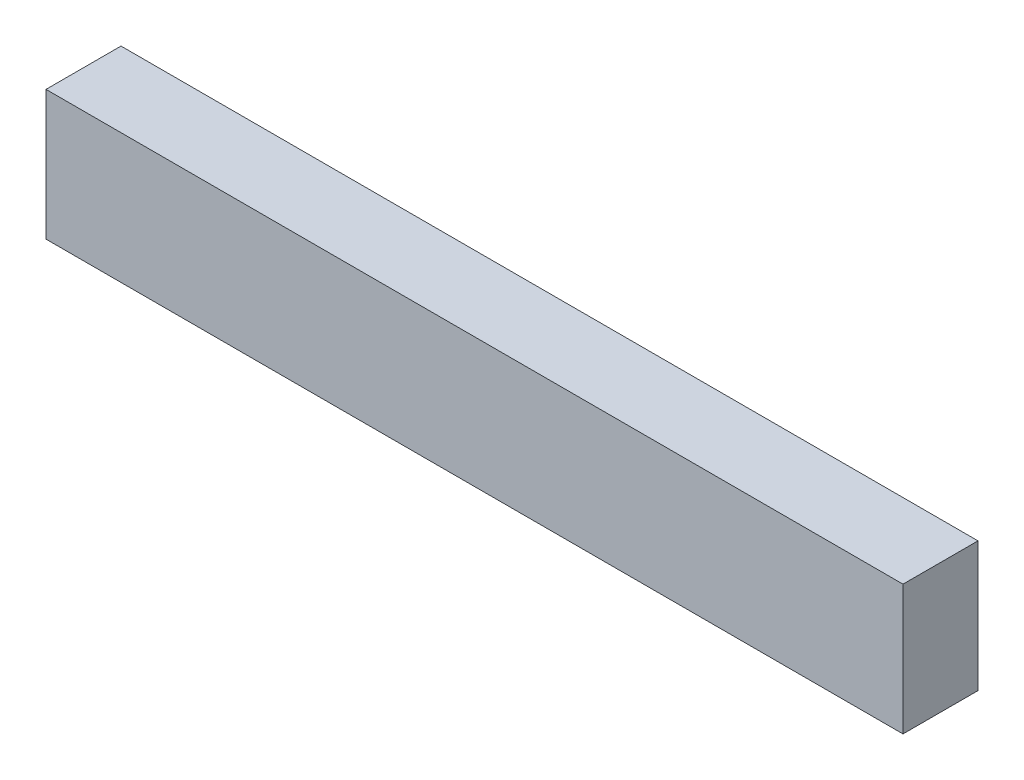
ISO-10303-21;
HEADER;
FILE_DESCRIPTION(('STEP AP214'),'2;1');
FILE_NAME('part.step','',(''),(''),'','','');
FILE_SCHEMA(('AUTOMOTIVE_DESIGN { 1 0 10303 214 1 1 1 1 }'));
ENDSEC;
DATA;
#1=APPLICATION_CONTEXT('core data for automotive mechanical design processes');
#2=APPLICATION_PROTOCOL_DEFINITION('international standard','automotive_design',2000,#1);
#3=PRODUCT_CONTEXT('',#1,'mechanical');
#4=PRODUCT('Part','Part','',(#3));
#5=PRODUCT_RELATED_PRODUCT_CATEGORY('part','',(#4));
#6=PRODUCT_DEFINITION_FORMATION('','',#4);
#7=PRODUCT_DEFINITION_CONTEXT('part definition',#1,'design');
#8=PRODUCT_DEFINITION('design','',#6,#7);
#9=PRODUCT_DEFINITION_SHAPE('','',#8);
#10=(LENGTH_UNIT() NAMED_UNIT(*) SI_UNIT(.MILLI.,.METRE.));
#11=(NAMED_UNIT(*) PLANE_ANGLE_UNIT() SI_UNIT($,.RADIAN.));
#12=(NAMED_UNIT(*) SI_UNIT($,.STERADIAN.) SOLID_ANGLE_UNIT());
#13=UNCERTAINTY_MEASURE_WITH_UNIT(LENGTH_MEASURE(1.E-05),#10,'distance_accuracy_value','');
#14=(GEOMETRIC_REPRESENTATION_CONTEXT(3) GLOBAL_UNCERTAINTY_ASSIGNED_CONTEXT((#13)) GLOBAL_UNIT_ASSIGNED_CONTEXT((#10,
#11,#12)) REPRESENTATION_CONTEXT('',''));
#15=CARTESIAN_POINT('',(0.,0.,0.));
#16=DIRECTION('',(0.,0.,1.));
#17=DIRECTION('',(1.,0.,0.));
#18=AXIS2_PLACEMENT_3D('',#15,#16,#17);
#19=CARTESIAN_POINT('',(-16.7754999999996,46.13,7.25));
#20=DIRECTION('',(1.,0.,0.));
#21=DIRECTION('',(0.,0.,-1.));
#22=AXIS2_PLACEMENT_3D('',#19,#20,#21);
#23=PLANE('',#22);
#24=DIRECTION('',(0.,-1.,0.));
#25=VECTOR('',#24,1.);
#26=CARTESIAN_POINT('',(-16.7754999999996,46.13,0.));
#27=LINE('',#26,#25);
#28=CARTESIAN_POINT('',(-16.7754999999996,46.13,0.));
#29=VERTEX_POINT('',#28);
#30=CARTESIAN_POINT('',(-16.7754999999996,33.59,0.));
#31=VERTEX_POINT('',#30);
#32=EDGE_CURVE('E128',#29,#31,#27,.T.);
#33=ORIENTED_EDGE('',*,*,#32,.T.);
#34=DIRECTION('',(0.,0.,-1.));
#35=VECTOR('',#34,1.);
#36=CARTESIAN_POINT('',(-16.7754999999996,33.59,7.25));
#37=LINE('',#36,#35);
#38=CARTESIAN_POINT('',(-16.7754999999996,33.59,7.25));
#39=VERTEX_POINT('',#38);
#40=EDGE_CURVE('E11',#39,#31,#37,.T.);
#41=ORIENTED_EDGE('',*,*,#40,.F.);
#42=DIRECTION('',(0.,-1.,0.));
#43=VECTOR('',#42,1.);
#44=CARTESIAN_POINT('',(-16.7754999999996,46.13,7.25));
#45=LINE('',#44,#43);
#46=CARTESIAN_POINT('',(-16.7754999999996,46.13,7.25));
#47=VERTEX_POINT('',#46);
#48=EDGE_CURVE('E148',#47,#39,#45,.T.);
#49=ORIENTED_EDGE('',*,*,#48,.F.);
#50=DIRECTION('',(0.,0.,-1.));
#51=VECTOR('',#50,1.);
#52=CARTESIAN_POINT('',(-16.7754999999996,46.13,7.25));
#53=LINE('',#52,#51);
#54=EDGE_CURVE('E153',#47,#29,#53,.T.);
#55=ORIENTED_EDGE('',*,*,#54,.T.);
#56=EDGE_LOOP('',(#33,#41,#49,#55));
#57=FACE_BOUND('',#56,.T.);
#58=ADVANCED_FACE('F32',(#57),#23,.F.);
#59=CARTESIAN_POINT('',(-16.7754999999996,33.59,7.25));
#60=DIRECTION('',(0.,1.,0.));
#61=DIRECTION('',(0.,0.,1.));
#62=AXIS2_PLACEMENT_3D('',#59,#60,#61);
#63=PLANE('',#62);
#64=DIRECTION('',(1.,0.,0.));
#65=VECTOR('',#64,1.);
#66=CARTESIAN_POINT('',(-16.7754999999996,33.59,0.));
#67=LINE('',#66,#65);
#68=CARTESIAN_POINT('',(66.0645000000004,33.59,0.));
#69=VERTEX_POINT('',#68);
#70=EDGE_CURVE('E132',#31,#69,#67,.T.);
#71=ORIENTED_EDGE('',*,*,#70,.T.);
#72=DIRECTION('',(0.,0.,-1.));
#73=VECTOR('',#72,1.);
#74=CARTESIAN_POINT('',(66.0645000000004,33.59,7.25));
#75=LINE('',#74,#73);
#76=CARTESIAN_POINT('',(66.0645000000004,33.59,7.25));
#77=VERTEX_POINT('',#76);
#78=EDGE_CURVE('E39',#77,#69,#75,.T.);
#79=ORIENTED_EDGE('',*,*,#78,.F.);
#80=DIRECTION('',(1.,0.,0.));
#81=VECTOR('',#80,1.);
#82=CARTESIAN_POINT('',(-16.7754999999996,33.59,7.25));
#83=LINE('',#82,#81);
#84=EDGE_CURVE('E83',#39,#77,#83,.T.);
#85=ORIENTED_EDGE('',*,*,#84,.F.);
#86=ORIENTED_EDGE('',*,*,#40,.T.);
#87=EDGE_LOOP('',(#71,#79,#85,#86));
#88=FACE_BOUND('',#87,.T.);
#89=ADVANCED_FACE('F182',(#88),#63,.F.);
#90=CARTESIAN_POINT('',(66.0645000000004,46.13,7.25));
#91=DIRECTION('',(-1.,0.,0.));
#92=DIRECTION('',(0.,0.,1.));
#93=AXIS2_PLACEMENT_3D('',#90,#91,#92);
#94=PLANE('',#93);
#95=DIRECTION('',(0.,1.,0.));
#96=VECTOR('',#95,1.);
#97=CARTESIAN_POINT('',(66.0645000000004,46.13,0.));
#98=LINE('',#97,#96);
#99=CARTESIAN_POINT('',(66.0645000000004,46.13,0.));
#100=VERTEX_POINT('',#99);
#101=EDGE_CURVE('E156',#69,#100,#98,.T.);
#102=ORIENTED_EDGE('',*,*,#101,.T.);
#103=DIRECTION('',(0.,0.,-1.));
#104=VECTOR('',#103,1.);
#105=CARTESIAN_POINT('',(66.0645000000004,46.13,7.25));
#106=LINE('',#105,#104);
#107=CARTESIAN_POINT('',(66.0645000000004,46.13,7.25));
#108=VERTEX_POINT('',#107);
#109=EDGE_CURVE('E160',#108,#100,#106,.T.);
#110=ORIENTED_EDGE('',*,*,#109,.F.);
#111=DIRECTION('',(0.,1.,0.));
#112=VECTOR('',#111,1.);
#113=CARTESIAN_POINT('',(66.0645000000004,46.13,7.25));
#114=LINE('',#113,#112);
#115=EDGE_CURVE('E151',#77,#108,#114,.T.);
#116=ORIENTED_EDGE('',*,*,#115,.F.);
#117=ORIENTED_EDGE('',*,*,#78,.T.);
#118=EDGE_LOOP('',(#102,#110,#116,#117));
#119=FACE_BOUND('',#118,.T.);
#120=ADVANCED_FACE('F165',(#119),#94,.F.);
#121=CARTESIAN_POINT('',(-16.7754999999996,46.13,7.25));
#122=DIRECTION('',(0.,-1.,0.));
#123=DIRECTION('',(0.,0.,-1.));
#124=AXIS2_PLACEMENT_3D('',#121,#122,#123);
#125=PLANE('',#124);
#126=DIRECTION('',(-1.,0.,0.));
#127=VECTOR('',#126,1.);
#128=CARTESIAN_POINT('',(-16.7754999999996,46.13,0.));
#129=LINE('',#128,#127);
#130=EDGE_CURVE('E76',#100,#29,#129,.T.);
#131=ORIENTED_EDGE('',*,*,#130,.T.);
#132=ORIENTED_EDGE('',*,*,#54,.F.);
#133=DIRECTION('',(-1.,0.,0.));
#134=VECTOR('',#133,1.);
#135=CARTESIAN_POINT('',(-16.7754999999996,46.13,7.25));
#136=LINE('',#135,#134);
#137=EDGE_CURVE('E55',#108,#47,#136,.T.);
#138=ORIENTED_EDGE('',*,*,#137,.F.);
#139=ORIENTED_EDGE('',*,*,#109,.T.);
#140=EDGE_LOOP('',(#131,#132,#138,#139));
#141=FACE_BOUND('',#140,.T.);
#142=ADVANCED_FACE('F173',(#141),#125,.F.);
#143=CARTESIAN_POINT('',(0.,0.,7.25));
#144=DIRECTION('',(0.,0.,1.));
#145=DIRECTION('',(1.,0.,0.));
#146=AXIS2_PLACEMENT_3D('',#143,#144,#145);
#147=PLANE('',#146);
#148=ORIENTED_EDGE('',*,*,#48,.T.);
#149=ORIENTED_EDGE('',*,*,#84,.T.);
#150=ORIENTED_EDGE('',*,*,#115,.T.);
#151=ORIENTED_EDGE('',*,*,#137,.T.);
#152=EDGE_LOOP('',(#148,#149,#150,#151));
#153=FACE_BOUND('',#152,.T.);
#154=ADVANCED_FACE('F175',(#153),#147,.T.);
#155=CARTESIAN_POINT('',(0.,0.,0.));
#156=DIRECTION('',(0.,0.,1.));
#157=DIRECTION('',(1.,0.,0.));
#158=AXIS2_PLACEMENT_3D('',#155,#156,#157);
#159=PLANE('',#158);
#160=DIRECTION('',(-1.,0.,0.));
#161=VECTOR('',#160,1.);
#162=CARTESIAN_POINT('',(-16.7754999999996,45.63,0.));
#163=LINE('',#162,#161);
#164=CARTESIAN_POINT('',(65.5645000000004,45.63,0.));
#165=VERTEX_POINT('',#164);
#166=CARTESIAN_POINT('',(-16.2754999999996,45.63,0.));
#167=VERTEX_POINT('',#166);
#168=EDGE_CURVE('E123',#165,#167,#163,.T.);
#169=ORIENTED_EDGE('',*,*,#168,.T.);
#170=DIRECTION('',(0.,-1.,0.));
#171=VECTOR('',#170,1.);
#172=CARTESIAN_POINT('',(-16.2754999999996,46.13,0.));
#173=LINE('',#172,#171);
#174=CARTESIAN_POINT('',(-16.2754999999996,34.09,0.));
#175=VERTEX_POINT('',#174);
#176=EDGE_CURVE('E142',#167,#175,#173,.T.);
#177=ORIENTED_EDGE('',*,*,#176,.T.);
#178=DIRECTION('',(1.,0.,0.));
#179=VECTOR('',#178,1.);
#180=CARTESIAN_POINT('',(-16.7754999999996,34.09,0.));
#181=LINE('',#180,#179);
#182=CARTESIAN_POINT('',(65.5645000000004,34.09,0.));
#183=VERTEX_POINT('',#182);
#184=EDGE_CURVE('E127',#175,#183,#181,.T.);
#185=ORIENTED_EDGE('',*,*,#184,.T.);
#186=DIRECTION('',(0.,1.,0.));
#187=VECTOR('',#186,1.);
#188=CARTESIAN_POINT('',(65.5645000000004,46.13,0.));
#189=LINE('',#188,#187);
#190=EDGE_CURVE('E46',#183,#165,#189,.T.);
#191=ORIENTED_EDGE('',*,*,#190,.T.);
#192=EDGE_LOOP('',(#169,#177,#185,#191));
#193=FACE_BOUND('',#192,.T.);
#194=ORIENTED_EDGE('',*,*,#32,.F.);
#195=ORIENTED_EDGE('',*,*,#130,.F.);
#196=ORIENTED_EDGE('',*,*,#101,.F.);
#197=ORIENTED_EDGE('',*,*,#70,.F.);
#198=EDGE_LOOP('',(#194,#195,#196,#197));
#199=FACE_BOUND('',#198,.T.);
#200=ADVANCED_FACE('F169',(#193,#199),#159,.F.);
#201=CARTESIAN_POINT('',(-16.2754999999996,46.13,7.25));
#202=DIRECTION('',(1.,0.,0.));
#203=DIRECTION('',(0.,0.,-1.));
#204=AXIS2_PLACEMENT_3D('',#201,#202,#203);
#205=PLANE('',#204);
#206=ORIENTED_EDGE('',*,*,#176,.F.);
#207=DIRECTION('',(0.,0.,-1.));
#208=VECTOR('',#207,1.);
#209=CARTESIAN_POINT('',(-16.2754999999996,45.63,7.25));
#210=LINE('',#209,#208);
#211=CARTESIAN_POINT('',(-16.2754999999996,45.63,7.05));
#212=VERTEX_POINT('',#211);
#213=EDGE_CURVE('E122',#212,#167,#210,.T.);
#214=ORIENTED_EDGE('',*,*,#213,.F.);
#215=DIRECTION('',(0.,-1.,0.));
#216=VECTOR('',#215,1.);
#217=CARTESIAN_POINT('',(-16.2754999999996,46.13,7.05));
#218=LINE('',#217,#216);
#219=CARTESIAN_POINT('',(-16.2754999999996,34.09,7.05));
#220=VERTEX_POINT('',#219);
#221=EDGE_CURVE('E110',#212,#220,#218,.T.);
#222=ORIENTED_EDGE('',*,*,#221,.T.);
#223=DIRECTION('',(0.,0.,-1.));
#224=VECTOR('',#223,1.);
#225=CARTESIAN_POINT('',(-16.2754999999996,34.09,7.25));
#226=LINE('',#225,#224);
#227=EDGE_CURVE('E120',#220,#175,#226,.T.);
#228=ORIENTED_EDGE('',*,*,#227,.T.);
#229=EDGE_LOOP('',(#206,#214,#222,#228));
#230=FACE_BOUND('',#229,.T.);
#231=ADVANCED_FACE('F119',(#230),#205,.T.);
#232=CARTESIAN_POINT('',(-16.7754999999996,34.09,7.25));
#233=DIRECTION('',(0.,1.,0.));
#234=DIRECTION('',(0.,0.,1.));
#235=AXIS2_PLACEMENT_3D('',#232,#233,#234);
#236=PLANE('',#235);
#237=ORIENTED_EDGE('',*,*,#184,.F.);
#238=ORIENTED_EDGE('',*,*,#227,.F.);
#239=DIRECTION('',(1.,0.,0.));
#240=VECTOR('',#239,1.);
#241=CARTESIAN_POINT('',(-16.7754999999996,34.09,7.05));
#242=LINE('',#241,#240);
#243=CARTESIAN_POINT('',(65.5645000000004,34.09,7.05));
#244=VERTEX_POINT('',#243);
#245=EDGE_CURVE('E106',#220,#244,#242,.T.);
#246=ORIENTED_EDGE('',*,*,#245,.T.);
#247=DIRECTION('',(0.,0.,-1.));
#248=VECTOR('',#247,1.);
#249=CARTESIAN_POINT('',(65.5645000000004,34.09,7.25));
#250=LINE('',#249,#248);
#251=EDGE_CURVE('E129',#244,#183,#250,.T.);
#252=ORIENTED_EDGE('',*,*,#251,.T.);
#253=EDGE_LOOP('',(#237,#238,#246,#252));
#254=FACE_BOUND('',#253,.T.);
#255=ADVANCED_FACE('F125',(#254),#236,.T.);
#256=CARTESIAN_POINT('',(65.5645000000004,46.13,7.25));
#257=DIRECTION('',(-1.,0.,0.));
#258=DIRECTION('',(0.,0.,1.));
#259=AXIS2_PLACEMENT_3D('',#256,#257,#258);
#260=PLANE('',#259);
#261=ORIENTED_EDGE('',*,*,#190,.F.);
#262=ORIENTED_EDGE('',*,*,#251,.F.);
#263=DIRECTION('',(0.,1.,0.));
#264=VECTOR('',#263,1.);
#265=CARTESIAN_POINT('',(65.5645000000004,46.13,7.05));
#266=LINE('',#265,#264);
#267=CARTESIAN_POINT('',(65.5645000000004,45.63,7.05));
#268=VERTEX_POINT('',#267);
#269=EDGE_CURVE('E111',#244,#268,#266,.T.);
#270=ORIENTED_EDGE('',*,*,#269,.T.);
#271=DIRECTION('',(0.,0.,-1.));
#272=VECTOR('',#271,1.);
#273=CARTESIAN_POINT('',(65.5645000000004,45.63,7.25));
#274=LINE('',#273,#272);
#275=EDGE_CURVE('E134',#268,#165,#274,.T.);
#276=ORIENTED_EDGE('',*,*,#275,.T.);
#277=EDGE_LOOP('',(#261,#262,#270,#276));
#278=FACE_BOUND('',#277,.T.);
#279=ADVANCED_FACE('F230',(#278),#260,.T.);
#280=CARTESIAN_POINT('',(-16.7754999999996,45.63,7.25));
#281=DIRECTION('',(0.,-1.,0.));
#282=DIRECTION('',(0.,0.,-1.));
#283=AXIS2_PLACEMENT_3D('',#280,#281,#282);
#284=PLANE('',#283);
#285=ORIENTED_EDGE('',*,*,#168,.F.);
#286=ORIENTED_EDGE('',*,*,#275,.F.);
#287=DIRECTION('',(-1.,0.,0.));
#288=VECTOR('',#287,1.);
#289=CARTESIAN_POINT('',(-16.7754999999996,45.63,7.05));
#290=LINE('',#289,#288);
#291=EDGE_CURVE('E137',#268,#212,#290,.T.);
#292=ORIENTED_EDGE('',*,*,#291,.T.);
#293=ORIENTED_EDGE('',*,*,#213,.T.);
#294=EDGE_LOOP('',(#285,#286,#292,#293));
#295=FACE_BOUND('',#294,.T.);
#296=ADVANCED_FACE('F239',(#295),#284,.T.);
#297=CARTESIAN_POINT('',(0.,0.,7.05));
#298=DIRECTION('',(0.,0.,1.));
#299=DIRECTION('',(1.,0.,0.));
#300=AXIS2_PLACEMENT_3D('',#297,#298,#299);
#301=PLANE('',#300);
#302=ORIENTED_EDGE('',*,*,#221,.F.);
#303=ORIENTED_EDGE('',*,*,#291,.F.);
#304=ORIENTED_EDGE('',*,*,#269,.F.);
#305=ORIENTED_EDGE('',*,*,#245,.F.);
#306=EDGE_LOOP('',(#302,#303,#304,#305));
#307=FACE_BOUND('',#306,.T.);
#308=ADVANCED_FACE('F108',(#307),#301,.F.);
#309=CLOSED_SHELL('',(#58,#89,#120,#142,#154,#200,#231,#255,#279,#296,#308));
#310=MANIFOLD_SOLID_BREP('B2',#309);
#311=ADVANCED_BREP_SHAPE_REPRESENTATION('',(#18,#310),#14);
#312=SHAPE_DEFINITION_REPRESENTATION(#9,#311);
ENDSEC;
END-ISO-10303-21;
